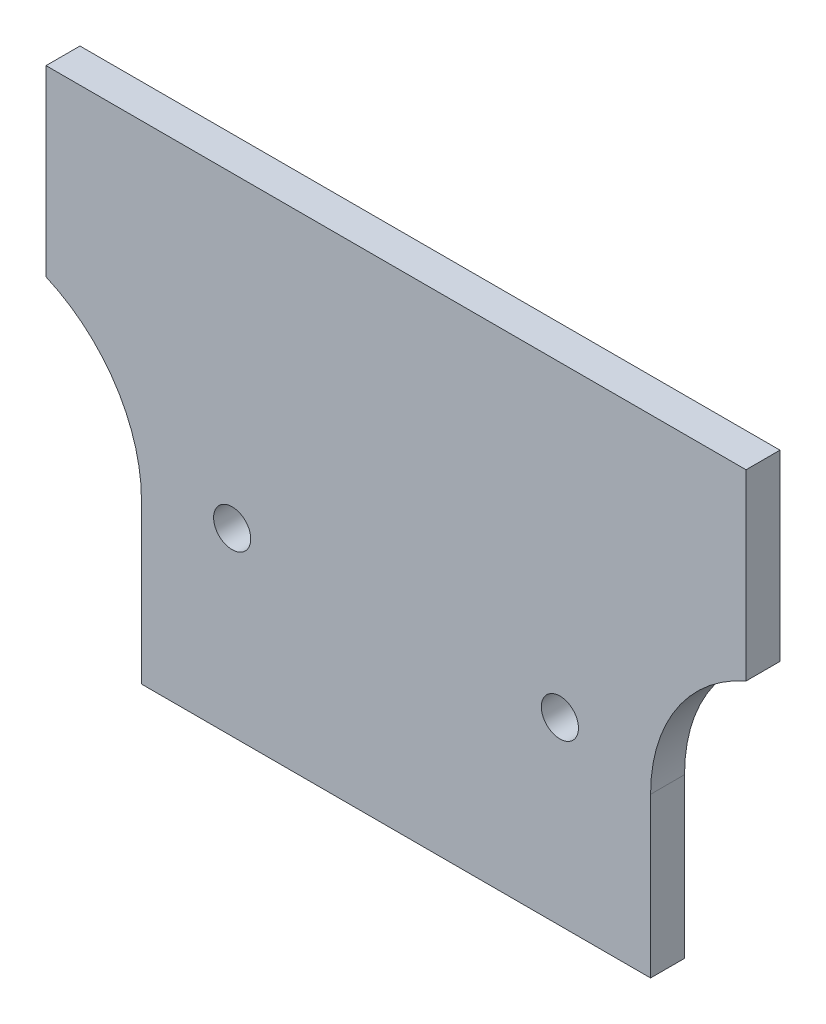
ISO-10303-21;
HEADER;
FILE_DESCRIPTION(('STEP AP214'),'2;1');
FILE_NAME('part.step','',(''),(''),'','','');
FILE_SCHEMA(('AUTOMOTIVE_DESIGN { 1 0 10303 214 1 1 1 1 }'));
ENDSEC;
DATA;
#1=APPLICATION_CONTEXT('core data for automotive mechanical design processes');
#2=APPLICATION_PROTOCOL_DEFINITION('international standard','automotive_design',2000,#1);
#3=PRODUCT_CONTEXT('',#1,'mechanical');
#4=PRODUCT('Part','Part','',(#3));
#5=PRODUCT_RELATED_PRODUCT_CATEGORY('part','',(#4));
#6=PRODUCT_DEFINITION_FORMATION('','',#4);
#7=PRODUCT_DEFINITION_CONTEXT('part definition',#1,'design');
#8=PRODUCT_DEFINITION('design','',#6,#7);
#9=PRODUCT_DEFINITION_SHAPE('','',#8);
#10=(LENGTH_UNIT() NAMED_UNIT(*) SI_UNIT(.MILLI.,.METRE.));
#11=(NAMED_UNIT(*) PLANE_ANGLE_UNIT() SI_UNIT($,.RADIAN.));
#12=(NAMED_UNIT(*) SI_UNIT($,.STERADIAN.) SOLID_ANGLE_UNIT());
#13=UNCERTAINTY_MEASURE_WITH_UNIT(LENGTH_MEASURE(1.E-05),#10,'distance_accuracy_value','');
#14=(GEOMETRIC_REPRESENTATION_CONTEXT(3) GLOBAL_UNCERTAINTY_ASSIGNED_CONTEXT((#13)) GLOBAL_UNIT_ASSIGNED_CONTEXT((#10,
#11,#12)) REPRESENTATION_CONTEXT('',''));
#15=CARTESIAN_POINT('',(0.,0.,0.));
#16=DIRECTION('',(0.,0.,1.));
#17=DIRECTION('',(1.,0.,0.));
#18=AXIS2_PLACEMENT_3D('',#15,#16,#17);
#19=CARTESIAN_POINT('',(5.715,-3.81,15.2930278987591));
#20=DIRECTION('',(0.,1.,0.));
#21=DIRECTION('',(-1.,0.,0.));
#22=AXIS2_PLACEMENT_3D('',#19,#20,#21);
#23=PLANE('',#22);
#24=DIRECTION('',(1.,0.,0.));
#25=VECTOR('',#24,1.);
#26=CARTESIAN_POINT('',(5.715,-3.81,0.812800000000001));
#27=LINE('',#26,#25);
#28=CARTESIAN_POINT('',(-6.096,-3.81,0.812799999999999));
#29=VERTEX_POINT('',#28);
#30=CARTESIAN_POINT('',(6.096,-3.81,0.812799999999999));
#31=VERTEX_POINT('',#30);
#32=EDGE_CURVE('E168',#29,#31,#27,.T.);
#33=ORIENTED_EDGE('',*,*,#32,.F.);
#34=DIRECTION('',(0.,0.,-1.));
#35=VECTOR('',#34,1.);
#36=CARTESIAN_POINT('',(-6.096,-3.81,21.2467803268967));
#37=LINE('',#36,#35);
#38=CARTESIAN_POINT('',(-6.096,-3.81,0.));
#39=VERTEX_POINT('',#38);
#40=EDGE_CURVE('E155',#29,#39,#37,.T.);
#41=ORIENTED_EDGE('',*,*,#40,.T.);
#42=DIRECTION('',(1.,0.,0.));
#43=VECTOR('',#42,1.);
#44=CARTESIAN_POINT('',(5.715,-3.81,0.));
#45=LINE('',#44,#43);
#46=CARTESIAN_POINT('',(6.096,-3.81,0.));
#47=VERTEX_POINT('',#46);
#48=EDGE_CURVE('E11',#39,#47,#45,.T.);
#49=ORIENTED_EDGE('',*,*,#48,.T.);
#50=DIRECTION('',(0.,0.,-1.));
#51=VECTOR('',#50,1.);
#52=CARTESIAN_POINT('',(6.096,-3.81,21.2467803268967));
#53=LINE('',#52,#51);
#54=EDGE_CURVE('E152',#31,#47,#53,.T.);
#55=ORIENTED_EDGE('',*,*,#54,.F.);
#56=EDGE_LOOP('',(#33,#41,#49,#55));
#57=FACE_BOUND('',#56,.T.);
#58=ADVANCED_FACE('F35',(#57),#23,.F.);
#59=CARTESIAN_POINT('',(-3.9243,0.507999999999999,15.2930278987591));
#60=DIRECTION('',(0.,0.,-1.));
#61=DIRECTION('',(-1.,0.,0.));
#62=AXIS2_PLACEMENT_3D('',#59,#60,#61);
#63=CYLINDRICAL_SURFACE('',#62,0.445);
#64=CARTESIAN_POINT('',(-3.9243,0.507999999999999,0.));
#65=DIRECTION('',(0.,0.,1.));
#66=DIRECTION('',(1.,0.,0.));
#67=AXIS2_PLACEMENT_3D('',#64,#65,#66);
#68=CIRCLE('',#67,0.445);
#69=CARTESIAN_POINT('',(-3.4793,0.507999999999999,0.));
#70=VERTEX_POINT('',#69);
#71=EDGE_CURVE('E43',#70,#70,#68,.T.);
#72=ORIENTED_EDGE('',*,*,#71,.F.);
#73=EDGE_LOOP('',(#72));
#74=FACE_BOUND('',#73,.T.);
#75=CARTESIAN_POINT('',(-3.9243,0.507999999999999,0.812800000000001));
#76=DIRECTION('',(0.,0.,1.));
#77=DIRECTION('',(1.,0.,0.));
#78=AXIS2_PLACEMENT_3D('',#75,#76,#77);
#79=CIRCLE('',#78,0.445);
#80=CARTESIAN_POINT('',(-3.4793,0.507999999999999,0.812800000000001));
#81=VERTEX_POINT('',#80);
#82=EDGE_CURVE('E165',#81,#81,#79,.T.);
#83=ORIENTED_EDGE('',*,*,#82,.T.);
#84=EDGE_LOOP('',(#83));
#85=FACE_BOUND('',#84,.T.);
#86=ADVANCED_FACE('F179',(#74,#85),#63,.F.);
#87=CARTESIAN_POINT('',(0.,0.,0.));
#88=DIRECTION('',(0.,0.,-1.));
#89=DIRECTION('',(-1.,0.,0.));
#90=AXIS2_PLACEMENT_3D('',#87,#88,#89);
#91=PLANE('',#90);
#92=ORIENTED_EDGE('',*,*,#48,.F.);
#93=DIRECTION('',(0.,-1.,0.));
#94=VECTOR('',#93,1.);
#95=CARTESIAN_POINT('',(-6.096,0.,0.));
#96=LINE('',#95,#94);
#97=CARTESIAN_POINT('',(-6.096,0.,0.));
#98=VERTEX_POINT('',#97);
#99=EDGE_CURVE('E145',#98,#39,#96,.T.);
#100=ORIENTED_EDGE('',*,*,#99,.F.);
#101=CARTESIAN_POINT('',(-9.906,0.,0.));
#102=DIRECTION('',(0.,0.,-1.));
#103=DIRECTION('',(1.,0.,0.));
#104=AXIS2_PLACEMENT_3D('',#101,#102,#103);
#105=CIRCLE('',#104,3.81);
#106=CARTESIAN_POINT('',(-8.382,3.49192267955635,0.));
#107=VERTEX_POINT('',#106);
#108=EDGE_CURVE('E142',#107,#98,#105,.T.);
#109=ORIENTED_EDGE('',*,*,#108,.F.);
#110=DIRECTION('',(0.,-1.,0.));
#111=VECTOR('',#110,1.);
#112=CARTESIAN_POINT('',(-8.382,7.874,0.));
#113=LINE('',#112,#111);
#114=CARTESIAN_POINT('',(-8.382,7.874,0.));
#115=VERTEX_POINT('',#114);
#116=EDGE_CURVE('E139',#115,#107,#113,.T.);
#117=ORIENTED_EDGE('',*,*,#116,.F.);
#118=DIRECTION('',(-1.,0.,0.));
#119=VECTOR('',#118,1.);
#120=CARTESIAN_POINT('',(8.382,7.874,0.));
#121=LINE('',#120,#119);
#122=CARTESIAN_POINT('',(8.382,7.874,0.));
#123=VERTEX_POINT('',#122);
#124=EDGE_CURVE('E136',#123,#115,#121,.T.);
#125=ORIENTED_EDGE('',*,*,#124,.F.);
#126=DIRECTION('',(0.,1.,0.));
#127=VECTOR('',#126,1.);
#128=CARTESIAN_POINT('',(8.382,3.49192267955635,0.));
#129=LINE('',#128,#127);
#130=CARTESIAN_POINT('',(8.382,3.49192267955635,0.));
#131=VERTEX_POINT('',#130);
#132=EDGE_CURVE('E117',#131,#123,#129,.T.);
#133=ORIENTED_EDGE('',*,*,#132,.F.);
#134=CARTESIAN_POINT('',(9.906,0.,0.));
#135=DIRECTION('',(0.,0.,-1.));
#136=DIRECTION('',(1.,0.,0.));
#137=AXIS2_PLACEMENT_3D('',#134,#135,#136);
#138=CIRCLE('',#137,3.81);
#139=CARTESIAN_POINT('',(6.096,0.,0.));
#140=VERTEX_POINT('',#139);
#141=EDGE_CURVE('E107',#140,#131,#138,.T.);
#142=ORIENTED_EDGE('',*,*,#141,.F.);
#143=DIRECTION('',(0.,1.,0.));
#144=VECTOR('',#143,1.);
#145=CARTESIAN_POINT('',(6.096,-3.81,0.));
#146=LINE('',#145,#144);
#147=EDGE_CURVE('E148',#47,#140,#146,.T.);
#148=ORIENTED_EDGE('',*,*,#147,.F.);
#149=EDGE_LOOP('',(#92,#100,#109,#117,#125,#133,#142,#148));
#150=FACE_BOUND('',#149,.T.);
#151=ORIENTED_EDGE('',*,*,#71,.T.);
#152=EDGE_LOOP('',(#151));
#153=FACE_BOUND('',#152,.T.);
#154=CARTESIAN_POINT('',(3.9243,0.508,0.));
#155=DIRECTION('',(0.,0.,1.));
#156=DIRECTION('',(1.,0.,0.));
#157=AXIS2_PLACEMENT_3D('',#154,#155,#156);
#158=CIRCLE('',#157,0.445);
#159=CARTESIAN_POINT('',(4.3693,0.508,0.));
#160=VERTEX_POINT('',#159);
#161=EDGE_CURVE('E170',#160,#160,#158,.T.);
#162=ORIENTED_EDGE('',*,*,#161,.T.);
#163=EDGE_LOOP('',(#162));
#164=FACE_BOUND('',#163,.T.);
#165=ADVANCED_FACE('F176',(#150,#153,#164),#91,.T.);
#166=CARTESIAN_POINT('',(3.9243,0.508,15.2930278987591));
#167=DIRECTION('',(0.,0.,-1.));
#168=DIRECTION('',(-1.,0.,0.));
#169=AXIS2_PLACEMENT_3D('',#166,#167,#168);
#170=CYLINDRICAL_SURFACE('',#169,0.445);
#171=ORIENTED_EDGE('',*,*,#161,.F.);
#172=EDGE_LOOP('',(#171));
#173=FACE_BOUND('',#172,.T.);
#174=CARTESIAN_POINT('',(3.9243,0.508,0.812800000000001));
#175=DIRECTION('',(0.,0.,1.));
#176=DIRECTION('',(1.,0.,0.));
#177=AXIS2_PLACEMENT_3D('',#174,#175,#176);
#178=CIRCLE('',#177,0.445);
#179=CARTESIAN_POINT('',(4.3693,0.508,0.812800000000001));
#180=VERTEX_POINT('',#179);
#181=EDGE_CURVE('E38',#180,#180,#178,.T.);
#182=ORIENTED_EDGE('',*,*,#181,.T.);
#183=EDGE_LOOP('',(#182));
#184=FACE_BOUND('',#183,.T.);
#185=ADVANCED_FACE('F186',(#173,#184),#170,.F.);
#186=CARTESIAN_POINT('',(0.,0.,0.8128));
#187=DIRECTION('',(0.,0.,1.));
#188=DIRECTION('',(1.,0.,0.));
#189=AXIS2_PLACEMENT_3D('',#186,#187,#188);
#190=PLANE('',#189);
#191=DIRECTION('',(0.,-1.,0.));
#192=VECTOR('',#191,1.);
#193=CARTESIAN_POINT('',(-6.096,0.,0.812799999999999));
#194=LINE('',#193,#192);
#195=CARTESIAN_POINT('',(-6.096,0.,0.812799999999999));
#196=VERTEX_POINT('',#195);
#197=EDGE_CURVE('E124',#196,#29,#194,.T.);
#198=ORIENTED_EDGE('',*,*,#197,.T.);
#199=ORIENTED_EDGE('',*,*,#32,.T.);
#200=DIRECTION('',(0.,1.,0.));
#201=VECTOR('',#200,1.);
#202=CARTESIAN_POINT('',(6.096,-3.81,0.812799999999999));
#203=LINE('',#202,#201);
#204=CARTESIAN_POINT('',(6.096,0.,0.812799999999999));
#205=VERTEX_POINT('',#204);
#206=EDGE_CURVE('E122',#31,#205,#203,.T.);
#207=ORIENTED_EDGE('',*,*,#206,.T.);
#208=CARTESIAN_POINT('',(9.906,0.,0.812799999999999));
#209=DIRECTION('',(0.,0.,1.));
#210=DIRECTION('',(1.,0.,0.));
#211=AXIS2_PLACEMENT_3D('',#208,#209,#210);
#212=CIRCLE('',#211,3.81);
#213=CARTESIAN_POINT('',(8.382,3.49192267955635,0.812799999999999));
#214=VERTEX_POINT('',#213);
#215=EDGE_CURVE('E104',#205,#214,#212,.F.);
#216=ORIENTED_EDGE('',*,*,#215,.T.);
#217=DIRECTION('',(0.,1.,0.));
#218=VECTOR('',#217,1.);
#219=CARTESIAN_POINT('',(8.382,3.49192267955635,0.812799999999999));
#220=LINE('',#219,#218);
#221=CARTESIAN_POINT('',(8.382,7.874,0.812799999999999));
#222=VERTEX_POINT('',#221);
#223=EDGE_CURVE('E113',#214,#222,#220,.T.);
#224=ORIENTED_EDGE('',*,*,#223,.T.);
#225=DIRECTION('',(-1.,0.,0.));
#226=VECTOR('',#225,1.);
#227=CARTESIAN_POINT('',(8.382,7.874,0.812799999999999));
#228=LINE('',#227,#226);
#229=CARTESIAN_POINT('',(-8.382,7.874,0.812799999999999));
#230=VERTEX_POINT('',#229);
#231=EDGE_CURVE('E58',#222,#230,#228,.T.);
#232=ORIENTED_EDGE('',*,*,#231,.T.);
#233=DIRECTION('',(0.,-1.,0.));
#234=VECTOR('',#233,1.);
#235=CARTESIAN_POINT('',(-8.382,7.874,0.812799999999999));
#236=LINE('',#235,#234);
#237=CARTESIAN_POINT('',(-8.382,3.49192267955635,0.812799999999999));
#238=VERTEX_POINT('',#237);
#239=EDGE_CURVE('E131',#230,#238,#236,.T.);
#240=ORIENTED_EDGE('',*,*,#239,.T.);
#241=CARTESIAN_POINT('',(-9.906,0.,0.812799999999999));
#242=DIRECTION('',(0.,0.,1.));
#243=DIRECTION('',(1.,0.,0.));
#244=AXIS2_PLACEMENT_3D('',#241,#242,#243);
#245=CIRCLE('',#244,3.81);
#246=EDGE_CURVE('E128',#238,#196,#245,.F.);
#247=ORIENTED_EDGE('',*,*,#246,.T.);
#248=EDGE_LOOP('',(#198,#199,#207,#216,#224,#232,#240,#247));
#249=FACE_BOUND('',#248,.T.);
#250=ORIENTED_EDGE('',*,*,#181,.F.);
#251=EDGE_LOOP('',(#250));
#252=FACE_BOUND('',#251,.T.);
#253=ORIENTED_EDGE('',*,*,#82,.F.);
#254=EDGE_LOOP('',(#253));
#255=FACE_BOUND('',#254,.T.);
#256=ADVANCED_FACE('F120',(#249,#252,#255),#190,.T.);
#257=CARTESIAN_POINT('',(9.906,0.,21.2467803268967));
#258=DIRECTION('',(0.,0.,-1.));
#259=DIRECTION('',(-1.,0.,0.));
#260=AXIS2_PLACEMENT_3D('',#257,#258,#259);
#261=CYLINDRICAL_SURFACE('',#260,3.81);
#262=ORIENTED_EDGE('',*,*,#215,.F.);
#263=DIRECTION('',(0.,0.,-1.));
#264=VECTOR('',#263,1.);
#265=CARTESIAN_POINT('',(6.096,0.,21.2467803268967));
#266=LINE('',#265,#264);
#267=EDGE_CURVE('E50',#205,#140,#266,.T.);
#268=ORIENTED_EDGE('',*,*,#267,.T.);
#269=ORIENTED_EDGE('',*,*,#141,.T.);
#270=DIRECTION('',(0.,0.,-1.));
#271=VECTOR('',#270,1.);
#272=CARTESIAN_POINT('',(8.382,3.49192267955635,21.2467803268967));
#273=LINE('',#272,#271);
#274=EDGE_CURVE('E100',#214,#131,#273,.T.);
#275=ORIENTED_EDGE('',*,*,#274,.F.);
#276=EDGE_LOOP('',(#262,#268,#269,#275));
#277=FACE_BOUND('',#276,.T.);
#278=ADVANCED_FACE('F102',(#277),#261,.F.);
#279=CARTESIAN_POINT('',(6.096,-3.81,21.2467803268967));
#280=DIRECTION('',(-1.,0.,0.));
#281=DIRECTION('',(0.,-1.,0.));
#282=AXIS2_PLACEMENT_3D('',#279,#280,#281);
#283=PLANE('',#282);
#284=ORIENTED_EDGE('',*,*,#206,.F.);
#285=ORIENTED_EDGE('',*,*,#54,.T.);
#286=ORIENTED_EDGE('',*,*,#147,.T.);
#287=ORIENTED_EDGE('',*,*,#267,.F.);
#288=EDGE_LOOP('',(#284,#285,#286,#287));
#289=FACE_BOUND('',#288,.T.);
#290=ADVANCED_FACE('F192',(#289),#283,.F.);
#291=CARTESIAN_POINT('',(-6.096,0.,21.2467803268967));
#292=DIRECTION('',(1.,0.,0.));
#293=DIRECTION('',(0.,1.,0.));
#294=AXIS2_PLACEMENT_3D('',#291,#292,#293);
#295=PLANE('',#294);
#296=ORIENTED_EDGE('',*,*,#197,.F.);
#297=DIRECTION('',(0.,0.,-1.));
#298=VECTOR('',#297,1.);
#299=CARTESIAN_POINT('',(-6.096,0.,21.2467803268967));
#300=LINE('',#299,#298);
#301=EDGE_CURVE('E158',#196,#98,#300,.T.);
#302=ORIENTED_EDGE('',*,*,#301,.T.);
#303=ORIENTED_EDGE('',*,*,#99,.T.);
#304=ORIENTED_EDGE('',*,*,#40,.F.);
#305=EDGE_LOOP('',(#296,#302,#303,#304));
#306=FACE_BOUND('',#305,.T.);
#307=ADVANCED_FACE('F204',(#306),#295,.F.);
#308=CARTESIAN_POINT('',(-9.906,0.,21.2467803268967));
#309=DIRECTION('',(0.,0.,-1.));
#310=DIRECTION('',(-1.,0.,0.));
#311=AXIS2_PLACEMENT_3D('',#308,#309,#310);
#312=CYLINDRICAL_SURFACE('',#311,3.81);
#313=ORIENTED_EDGE('',*,*,#246,.F.);
#314=DIRECTION('',(0.,0.,-1.));
#315=VECTOR('',#314,1.);
#316=CARTESIAN_POINT('',(-8.382,3.49192267955635,21.2467803268967));
#317=LINE('',#316,#315);
#318=EDGE_CURVE('E160',#238,#107,#317,.T.);
#319=ORIENTED_EDGE('',*,*,#318,.T.);
#320=ORIENTED_EDGE('',*,*,#108,.T.);
#321=ORIENTED_EDGE('',*,*,#301,.F.);
#322=EDGE_LOOP('',(#313,#319,#320,#321));
#323=FACE_BOUND('',#322,.T.);
#324=ADVANCED_FACE('F209',(#323),#312,.F.);
#325=CARTESIAN_POINT('',(-8.382,7.874,21.2467803268967));
#326=DIRECTION('',(1.,0.,0.));
#327=DIRECTION('',(0.,1.,0.));
#328=AXIS2_PLACEMENT_3D('',#325,#326,#327);
#329=PLANE('',#328);
#330=ORIENTED_EDGE('',*,*,#239,.F.);
#331=DIRECTION('',(0.,0.,-1.));
#332=VECTOR('',#331,1.);
#333=CARTESIAN_POINT('',(-8.382,7.874,21.2467803268967));
#334=LINE('',#333,#332);
#335=EDGE_CURVE('E162',#230,#115,#334,.T.);
#336=ORIENTED_EDGE('',*,*,#335,.T.);
#337=ORIENTED_EDGE('',*,*,#116,.T.);
#338=ORIENTED_EDGE('',*,*,#318,.F.);
#339=EDGE_LOOP('',(#330,#336,#337,#338));
#340=FACE_BOUND('',#339,.T.);
#341=ADVANCED_FACE('F211',(#340),#329,.F.);
#342=CARTESIAN_POINT('',(8.382,7.874,21.2467803268967));
#343=DIRECTION('',(0.,-1.,0.));
#344=DIRECTION('',(1.,0.,0.));
#345=AXIS2_PLACEMENT_3D('',#342,#343,#344);
#346=PLANE('',#345);
#347=ORIENTED_EDGE('',*,*,#231,.F.);
#348=DIRECTION('',(0.,0.,-1.));
#349=VECTOR('',#348,1.);
#350=CARTESIAN_POINT('',(8.382,7.874,21.2467803268967));
#351=LINE('',#350,#349);
#352=EDGE_CURVE('E115',#222,#123,#351,.T.);
#353=ORIENTED_EDGE('',*,*,#352,.T.);
#354=ORIENTED_EDGE('',*,*,#124,.T.);
#355=ORIENTED_EDGE('',*,*,#335,.F.);
#356=EDGE_LOOP('',(#347,#353,#354,#355));
#357=FACE_BOUND('',#356,.T.);
#358=ADVANCED_FACE('F217',(#357),#346,.F.);
#359=CARTESIAN_POINT('',(8.382,3.49192267955635,21.2467803268967));
#360=DIRECTION('',(-1.,0.,0.));
#361=DIRECTION('',(0.,-1.,0.));
#362=AXIS2_PLACEMENT_3D('',#359,#360,#361);
#363=PLANE('',#362);
#364=ORIENTED_EDGE('',*,*,#223,.F.);
#365=ORIENTED_EDGE('',*,*,#274,.T.);
#366=ORIENTED_EDGE('',*,*,#132,.T.);
#367=ORIENTED_EDGE('',*,*,#352,.F.);
#368=EDGE_LOOP('',(#364,#365,#366,#367));
#369=FACE_BOUND('',#368,.T.);
#370=ADVANCED_FACE('F114',(#369),#363,.F.);
#371=CLOSED_SHELL('',(#58,#86,#165,#185,#256,#278,#290,#307,#324,#341,#358,#370));
#372=MANIFOLD_SOLID_BREP('B2',#371);
#373=ADVANCED_BREP_SHAPE_REPRESENTATION('',(#18,#372),#14);
#374=SHAPE_DEFINITION_REPRESENTATION(#9,#373);
ENDSEC;
END-ISO-10303-21;
